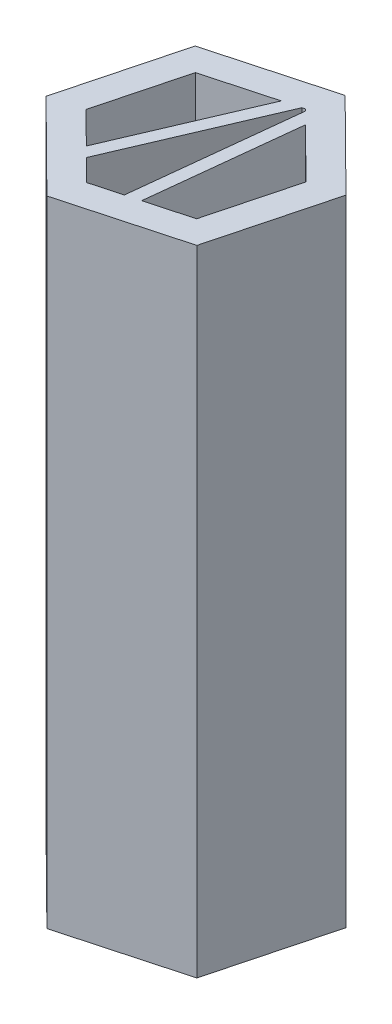
ISO-10303-21;
HEADER;
FILE_DESCRIPTION(('STEP AP214'),'2;1');
FILE_NAME('part.step','',(''),(''),'','','');
FILE_SCHEMA(('AUTOMOTIVE_DESIGN { 1 0 10303 214 1 1 1 1 }'));
ENDSEC;
DATA;
#1=APPLICATION_CONTEXT('core data for automotive mechanical design processes');
#2=APPLICATION_PROTOCOL_DEFINITION('international standard','automotive_design',2000,#1);
#3=PRODUCT_CONTEXT('',#1,'mechanical');
#4=PRODUCT('Part','Part','',(#3));
#5=PRODUCT_RELATED_PRODUCT_CATEGORY('part','',(#4));
#6=PRODUCT_DEFINITION_FORMATION('','',#4);
#7=PRODUCT_DEFINITION_CONTEXT('part definition',#1,'design');
#8=PRODUCT_DEFINITION('design','',#6,#7);
#9=PRODUCT_DEFINITION_SHAPE('','',#8);
#10=(LENGTH_UNIT() NAMED_UNIT(*) SI_UNIT(.MILLI.,.METRE.));
#11=(NAMED_UNIT(*) PLANE_ANGLE_UNIT() SI_UNIT($,.RADIAN.));
#12=(NAMED_UNIT(*) SI_UNIT($,.STERADIAN.) SOLID_ANGLE_UNIT());
#13=UNCERTAINTY_MEASURE_WITH_UNIT(LENGTH_MEASURE(1.E-05),#10,'distance_accuracy_value','');
#14=(GEOMETRIC_REPRESENTATION_CONTEXT(3) GLOBAL_UNCERTAINTY_ASSIGNED_CONTEXT((#13)) GLOBAL_UNIT_ASSIGNED_CONTEXT((#10,
#11,#12)) REPRESENTATION_CONTEXT('',''));
#15=CARTESIAN_POINT('',(0.,0.,0.));
#16=DIRECTION('',(0.,0.,1.));
#17=DIRECTION('',(1.,0.,0.));
#18=AXIS2_PLACEMENT_3D('',#15,#16,#17);
#19=CARTESIAN_POINT('',(-1.61287493858223,45.,6.14263524603461));
#20=DIRECTION('',(-0.263669614670392,0.,-0.964613048999218));
#21=DIRECTION('',(-0.964613048999218,0.,0.263669614670392));
#22=AXIS2_PLACEMENT_3D('',#19,#20,#21);
#23=PLANE('',#22);
#24=DIRECTION('',(0.,1.,0.));
#25=VECTOR('',#24,1.);
#26=CARTESIAN_POINT('',(0.485569831687937,0.,5.56904138416609));
#27=LINE('',#26,#25);
#28=CARTESIAN_POINT('',(0.485569831687937,0.,5.56904138416609));
#29=VERTEX_POINT('',#28);
#30=CARTESIAN_POINT('',(0.485569831687937,45.,5.56904138416609));
#31=VERTEX_POINT('',#30);
#32=EDGE_CURVE('E211',#29,#31,#27,.T.);
#33=ORIENTED_EDGE('',*,*,#32,.F.);
#34=DIRECTION('',(0.964613048999218,0.,-0.263669614670392));
#35=VECTOR('',#34,1.);
#36=CARTESIAN_POINT('',(-1.61287493858223,0.,6.14263524603461));
#37=LINE('',#36,#35);
#38=CARTESIAN_POINT('',(-1.61287493858223,0.,6.14263524603461));
#39=VERTEX_POINT('',#38);
#40=EDGE_CURVE('E275',#39,#29,#37,.T.);
#41=ORIENTED_EDGE('',*,*,#40,.F.);
#42=DIRECTION('',(0.,-1.,0.));
#43=VECTOR('',#42,1.);
#44=CARTESIAN_POINT('',(-1.61287493858223,45.,6.14263524603461));
#45=LINE('',#44,#43);
#46=CARTESIAN_POINT('',(-1.61287493858223,45.,6.14263524603461));
#47=VERTEX_POINT('',#46);
#48=EDGE_CURVE('E314',#47,#39,#45,.T.);
#49=ORIENTED_EDGE('',*,*,#48,.F.);
#50=DIRECTION('',(0.964613048999218,0.,-0.263669614670392));
#51=VECTOR('',#50,1.);
#52=CARTESIAN_POINT('',(-1.61287493858223,45.,6.14263524603461));
#53=LINE('',#52,#51);
#54=EDGE_CURVE('E55',#47,#31,#53,.T.);
#55=ORIENTED_EDGE('',*,*,#54,.T.);
#56=EDGE_LOOP('',(#33,#41,#49,#55));
#57=FACE_BOUND('',#56,.T.);
#58=ADVANCED_FACE('F39',(#57),#23,.T.);
#59=CARTESIAN_POINT('',(6.12611563853875,45.,-1.67452695307783));
#60=DIRECTION('',(-0.703544597920089,0.,0.710651109010223));
#61=DIRECTION('',(0.710651109010223,0.,0.703544597920089));
#62=AXIS2_PLACEMENT_3D('',#59,#60,#61);
#63=PLANE('',#62);
#64=DIRECTION('',(0.,1.,0.));
#65=VECTOR('',#64,1.);
#66=CARTESIAN_POINT('',(1.75500516038426,0.,-6.00192632645059));
#67=LINE('',#66,#65);
#68=CARTESIAN_POINT('',(1.75500516038426,0.,-6.00192632645059));
#69=VERTEX_POINT('',#68);
#70=CARTESIAN_POINT('',(1.75500516038426,45.,-6.00192632645059));
#71=VERTEX_POINT('',#70);
#72=EDGE_CURVE('E215',#69,#71,#67,.T.);
#73=ORIENTED_EDGE('',*,*,#72,.T.);
#74=DIRECTION('',(-0.710651109010223,0.,-0.703544597920089));
#75=VECTOR('',#74,1.);
#76=CARTESIAN_POINT('',(6.12611563853875,45.,-1.67452695307783));
#77=LINE('',#76,#75);
#78=CARTESIAN_POINT('',(1.61287493858221,45.,-6.14263524603461));
#79=VERTEX_POINT('',#78);
#80=EDGE_CURVE('E259',#71,#79,#77,.T.);
#81=ORIENTED_EDGE('',*,*,#80,.T.);
#82=DIRECTION('',(0.,-1.,0.));
#83=VECTOR('',#82,1.);
#84=CARTESIAN_POINT('',(1.61287493858221,45.,-6.14263524603461));
#85=LINE('',#84,#83);
#86=CARTESIAN_POINT('',(1.61287493858221,0.,-6.14263524603461));
#87=VERTEX_POINT('',#86);
#88=EDGE_CURVE('E304',#79,#87,#85,.T.);
#89=ORIENTED_EDGE('',*,*,#88,.T.);
#90=DIRECTION('',(-0.710651109010223,0.,-0.703544597920089));
#91=VECTOR('',#90,1.);
#92=CARTESIAN_POINT('',(6.12611563853875,0.,-1.67452695307783));
#93=LINE('',#92,#91);
#94=EDGE_CURVE('E283',#69,#87,#93,.T.);
#95=ORIENTED_EDGE('',*,*,#94,.F.);
#96=EDGE_LOOP('',(#73,#81,#89,#95));
#97=FACE_BOUND('',#96,.T.);
#98=ADVANCED_FACE('F418',(#97),#63,.T.);
#99=CARTESIAN_POINT('',(-6.12611563853876,45.,1.67452695307783));
#100=DIRECTION('',(0.70354459792009,0.,-0.710651109010222));
#101=DIRECTION('',(-0.710651109010222,0.,-0.70354459792009));
#102=AXIS2_PLACEMENT_3D('',#99,#100,#101);
#103=PLANE('',#102);
#104=DIRECTION('',(0.,1.,0.));
#105=VECTOR('',#104,1.);
#106=CARTESIAN_POINT('',(-3.86949528856049,0.,3.90858109955622));
#107=LINE('',#106,#105);
#108=CARTESIAN_POINT('',(-3.86949528856049,0.,3.90858109955622));
#109=VERTEX_POINT('',#108);
#110=CARTESIAN_POINT('',(-3.86949528856049,45.,3.90858109955622));
#111=VERTEX_POINT('',#110);
#112=EDGE_CURVE('E237',#109,#111,#107,.T.);
#113=ORIENTED_EDGE('',*,*,#112,.F.);
#114=DIRECTION('',(0.710651109010222,0.,0.70354459792009));
#115=VECTOR('',#114,1.);
#116=CARTESIAN_POINT('',(-6.12611563853876,0.,1.67452695307783));
#117=LINE('',#116,#115);
#118=CARTESIAN_POINT('',(-6.12611563853876,0.,1.67452695307783));
#119=VERTEX_POINT('',#118);
#120=EDGE_CURVE('E271',#119,#109,#117,.T.);
#121=ORIENTED_EDGE('',*,*,#120,.F.);
#122=DIRECTION('',(0.,-1.,0.));
#123=VECTOR('',#122,1.);
#124=CARTESIAN_POINT('',(-6.12611563853876,45.,1.67452695307783));
#125=LINE('',#124,#123);
#126=CARTESIAN_POINT('',(-6.12611563853876,45.,1.67452695307783));
#127=VERTEX_POINT('',#126);
#128=EDGE_CURVE('E270',#127,#119,#125,.T.);
#129=ORIENTED_EDGE('',*,*,#128,.F.);
#130=DIRECTION('',(0.710651109010222,0.,0.70354459792009));
#131=VECTOR('',#130,1.);
#132=CARTESIAN_POINT('',(-6.12611563853876,45.,1.67452695307783));
#133=LINE('',#132,#131);
#134=EDGE_CURVE('E188',#127,#111,#133,.T.);
#135=ORIENTED_EDGE('',*,*,#134,.T.);
#136=EDGE_LOOP('',(#113,#121,#129,#135));
#137=FACE_BOUND('',#136,.T.);
#138=ADVANCED_FACE('F414',(#137),#103,.T.);
#139=CARTESIAN_POINT('',(1.61287493858221,45.,-6.14263524603461));
#140=DIRECTION('',(0.263669614670392,0.,0.964613048999218));
#141=DIRECTION('',(0.964613048999218,0.,-0.263669614670392));
#142=AXIS2_PLACEMENT_3D('',#139,#140,#141);
#143=PLANE('',#142);
#144=DIRECTION('',(0.,1.,0.));
#145=VECTOR('',#144,1.);
#146=CARTESIAN_POINT('',(0.274314049450155,0.,-5.77674984336825));
#147=LINE('',#146,#145);
#148=CARTESIAN_POINT('',(0.274314049450155,0.,-5.77674984336825));
#149=VERTEX_POINT('',#148);
#150=CARTESIAN_POINT('',(0.274314049450155,45.,-5.77674984336825));
#151=VERTEX_POINT('',#150);
#152=EDGE_CURVE('E242',#149,#151,#147,.T.);
#153=ORIENTED_EDGE('',*,*,#152,.T.);
#154=DIRECTION('',(-0.964613048999218,0.,0.263669614670392));
#155=VECTOR('',#154,1.);
#156=CARTESIAN_POINT('',(1.61287493858221,45.,-6.14263524603461));
#157=LINE('',#156,#155);
#158=CARTESIAN_POINT('',(-4.51324069995654,45.,-4.46810829295678));
#159=VERTEX_POINT('',#158);
#160=EDGE_CURVE('E263',#151,#159,#157,.T.);
#161=ORIENTED_EDGE('',*,*,#160,.T.);
#162=DIRECTION('',(0.,-1.,0.));
#163=VECTOR('',#162,1.);
#164=CARTESIAN_POINT('',(-4.51324069995654,45.,-4.46810829295678));
#165=LINE('',#164,#163);
#166=CARTESIAN_POINT('',(-4.51324069995654,0.,-4.46810829295678));
#167=VERTEX_POINT('',#166);
#168=EDGE_CURVE('E300',#159,#167,#165,.T.);
#169=ORIENTED_EDGE('',*,*,#168,.T.);
#170=DIRECTION('',(-0.964613048999218,0.,0.263669614670392));
#171=VECTOR('',#170,1.);
#172=CARTESIAN_POINT('',(1.61287493858221,0.,-6.14263524603461));
#173=LINE('',#172,#171);
#174=EDGE_CURVE('E288',#149,#167,#173,.T.);
#175=ORIENTED_EDGE('',*,*,#174,.F.);
#176=EDGE_LOOP('',(#153,#161,#169,#175));
#177=FACE_BOUND('',#176,.T.);
#178=ADVANCED_FACE('F444',(#177),#143,.T.);
#179=CARTESIAN_POINT('',(0.,45.,0.));
#180=DIRECTION('',(0.,1.,0.));
#181=DIRECTION('',(0.,0.,1.));
#182=AXIS2_PLACEMENT_3D('',#179,#180,#181);
#183=PLANE('',#182);
#184=CARTESIAN_POINT('',(1.45018288068715,45.,5.30537176949569));
#185=VERTEX_POINT('',#184);
#186=CARTESIAN_POINT('',(4.51324069995653,45.,4.46810829295678));
#187=VERTEX_POINT('',#186);
#188=EDGE_CURVE('E179',#185,#187,#53,.T.);
#189=ORIENTED_EDGE('',*,*,#188,.F.);
#190=DIRECTION('',(0.109054331666609,0.,-0.994035790474744));
#191=VECTOR('',#190,1.);
#192=CARTESIAN_POINT('',(1.45018288068715,45.,5.30537176949569));
#193=LINE('',#192,#191);
#194=CARTESIAN_POINT('',(2.59902143673121,45.,-5.16635021286715));
#195=VERTEX_POINT('',#194);
#196=EDGE_CURVE('E184',#185,#195,#193,.T.);
#197=ORIENTED_EDGE('',*,*,#196,.T.);
#198=CARTESIAN_POINT('',(6.12611563853875,45.,-1.67452695307783));
#199=VERTEX_POINT('',#198);
#200=EDGE_CURVE('E260',#199,#195,#77,.T.);
#201=ORIENTED_EDGE('',*,*,#200,.F.);
#202=DIRECTION('',(0.253961939988995,0.,-0.967214212590482));
#203=VECTOR('',#202,1.);
#204=CARTESIAN_POINT('',(4.51324069995653,45.,4.46810829295678));
#205=LINE('',#204,#203);
#206=EDGE_CURVE('E185',#187,#199,#205,.T.);
#207=ORIENTED_EDGE('',*,*,#206,.F.);
#208=EDGE_LOOP('',(#189,#197,#201,#207));
#209=FACE_BOUND('',#208,.T.);
#210=CARTESIAN_POINT('',(-3.15884417955027,45.,4.61212569747631));
#211=VERTEX_POINT('',#210);
#212=EDGE_CURVE('E254',#211,#47,#133,.T.);
#213=ORIENTED_EDGE('',*,*,#212,.F.);
#214=DIRECTION('',(0.393354101438492,0.,-0.919387051726049));
#215=VECTOR('',#214,1.);
#216=CARTESIAN_POINT('',(1.41995232878237,45.,-6.08990132310053));
#217=LINE('',#216,#215);
#218=CARTESIAN_POINT('',(1.41995232878237,45.,-6.08990132310053));
#219=VERTEX_POINT('',#218);
#220=EDGE_CURVE('E214',#211,#219,#217,.T.);
#221=ORIENTED_EDGE('',*,*,#220,.T.);
#222=EDGE_CURVE('E264',#79,#219,#157,.T.);
#223=ORIENTED_EDGE('',*,*,#222,.F.);
#224=ORIENTED_EDGE('',*,*,#80,.F.);
#225=DIRECTION('',(-0.109054331666609,0.,0.994035790474744));
#226=VECTOR('',#225,1.);
#227=CARTESIAN_POINT('',(1.75500516038426,45.,-6.00192632645059));
#228=LINE('',#227,#226);
#229=EDGE_CURVE('E202',#71,#31,#228,.T.);
#230=ORIENTED_EDGE('',*,*,#229,.T.);
#231=ORIENTED_EDGE('',*,*,#54,.F.);
#232=EDGE_LOOP('',(#213,#221,#223,#224,#230,#231));
#233=FACE_BOUND('',#232,.T.);
#234=DIRECTION('',(0.964613048999217,0.,-0.263669614670393));
#235=VECTOR('',#234,1.);
#236=CARTESIAN_POINT('',(-2.19937491624849,45.,8.3763207900472));
#237=LINE('',#236,#235);
#238=CARTESIAN_POINT('',(-2.19937491624849,45.,8.3763207900472));
#239=VERTEX_POINT('',#238);
#240=CARTESIAN_POINT('',(6.15441913630438,45.,6.09287494494106));
#241=VERTEX_POINT('',#240);
#242=EDGE_CURVE('E319',#239,#241,#237,.T.);
#243=ORIENTED_EDGE('',*,*,#242,.T.);
#244=DIRECTION('',(0.253961939988995,0.,-0.967214212590482));
#245=VECTOR('',#244,1.);
#246=CARTESIAN_POINT('',(6.15441913630438,45.,6.09287494494106));
#247=LINE('',#246,#245);
#248=CARTESIAN_POINT('',(8.35379405255286,45.,-2.28344584510614));
#249=VERTEX_POINT('',#248);
#250=EDGE_CURVE('E323',#241,#249,#247,.T.);
#251=ORIENTED_EDGE('',*,*,#250,.T.);
#252=DIRECTION('',(-0.710651109010223,0.,-0.70354459792009));
#253=VECTOR('',#252,1.);
#254=CARTESIAN_POINT('',(8.35379405255286,45.,-2.28344584510614));
#255=LINE('',#254,#253);
#256=CARTESIAN_POINT('',(2.19937491624849,45.,-8.3763207900472));
#257=VERTEX_POINT('',#256);
#258=EDGE_CURVE('E327',#249,#257,#255,.T.);
#259=ORIENTED_EDGE('',*,*,#258,.T.);
#260=DIRECTION('',(-0.964613048999218,0.,0.263669614670392));
#261=VECTOR('',#260,1.);
#262=CARTESIAN_POINT('',(2.19937491624849,45.,-8.3763207900472));
#263=LINE('',#262,#261);
#264=CARTESIAN_POINT('',(-6.15441913630437,45.,-6.09287494494106));
#265=VERTEX_POINT('',#264);
#266=EDGE_CURVE('E330',#257,#265,#263,.T.);
#267=ORIENTED_EDGE('',*,*,#266,.T.);
#268=DIRECTION('',(-0.253961939988995,0.,0.967214212590482));
#269=VECTOR('',#268,1.);
#270=CARTESIAN_POINT('',(-6.15441913630437,45.,-6.09287494494106));
#271=LINE('',#270,#269);
#272=CARTESIAN_POINT('',(-8.35379405255286,45.,2.28344584510614));
#273=VERTEX_POINT('',#272);
#274=EDGE_CURVE('E333',#265,#273,#271,.T.);
#275=ORIENTED_EDGE('',*,*,#274,.T.);
#276=DIRECTION('',(0.710651109010223,0.,0.70354459792009));
#277=VECTOR('',#276,1.);
#278=CARTESIAN_POINT('',(-8.35379405255286,45.,2.28344584510614));
#279=LINE('',#278,#277);
#280=EDGE_CURVE('E336',#273,#239,#279,.T.);
#281=ORIENTED_EDGE('',*,*,#280,.T.);
#282=EDGE_LOOP('',(#243,#251,#259,#267,#275,#281));
#283=FACE_BOUND('',#282,.T.);
#284=DIRECTION('',(-0.393354101438492,0.,0.919387051726049));
#285=VECTOR('',#284,1.);
#286=CARTESIAN_POINT('',(-3.86949528856049,45.,3.90858109955622));
#287=LINE('',#286,#285);
#288=EDGE_CURVE('E226',#151,#111,#287,.T.);
#289=ORIENTED_EDGE('',*,*,#288,.T.);
#290=ORIENTED_EDGE('',*,*,#134,.F.);
#291=DIRECTION('',(-0.253961939988995,0.,0.967214212590482));
#292=VECTOR('',#291,1.);
#293=CARTESIAN_POINT('',(-4.51324069995654,45.,-4.46810829295678));
#294=LINE('',#293,#292);
#295=EDGE_CURVE('E267',#159,#127,#294,.T.);
#296=ORIENTED_EDGE('',*,*,#295,.F.);
#297=ORIENTED_EDGE('',*,*,#160,.F.);
#298=EDGE_LOOP('',(#289,#290,#296,#297));
#299=FACE_BOUND('',#298,.T.);
#300=ADVANCED_FACE('F180',(#209,#233,#283,#299),#183,.T.);
#301=CARTESIAN_POINT('',(0.,0.,0.));
#302=DIRECTION('',(0.,1.,0.));
#303=DIRECTION('',(0.,0.,1.));
#304=AXIS2_PLACEMENT_3D('',#301,#302,#303);
#305=PLANE('',#304);
#306=DIRECTION('',(0.109054331666609,0.,-0.994035790474744));
#307=VECTOR('',#306,1.);
#308=CARTESIAN_POINT('',(1.45018288068715,0.,5.30537176949569));
#309=LINE('',#308,#307);
#310=CARTESIAN_POINT('',(1.45018288068715,0.,5.3053717694957));
#311=VERTEX_POINT('',#310);
#312=CARTESIAN_POINT('',(2.59902143673121,0.,-5.16635021286715));
#313=VERTEX_POINT('',#312);
#314=EDGE_CURVE('E206',#311,#313,#309,.T.);
#315=ORIENTED_EDGE('',*,*,#314,.F.);
#316=CARTESIAN_POINT('',(4.51324069995653,0.,4.46810829295678));
#317=VERTEX_POINT('',#316);
#318=EDGE_CURVE('E63',#311,#317,#37,.T.);
#319=ORIENTED_EDGE('',*,*,#318,.T.);
#320=DIRECTION('',(0.253961939988995,0.,-0.967214212590482));
#321=VECTOR('',#320,1.);
#322=CARTESIAN_POINT('',(4.51324069995653,0.,4.46810829295678));
#323=LINE('',#322,#321);
#324=CARTESIAN_POINT('',(6.12611563853875,0.,-1.67452695307783));
#325=VERTEX_POINT('',#324);
#326=EDGE_CURVE('E279',#317,#325,#323,.T.);
#327=ORIENTED_EDGE('',*,*,#326,.T.);
#328=EDGE_CURVE('E284',#325,#313,#93,.T.);
#329=ORIENTED_EDGE('',*,*,#328,.T.);
#330=EDGE_LOOP('',(#315,#319,#327,#329));
#331=FACE_BOUND('',#330,.T.);
#332=DIRECTION('',(0.393354101438492,0.,-0.919387051726049));
#333=VECTOR('',#332,1.);
#334=CARTESIAN_POINT('',(1.41995232878237,0.,-6.08990132310053));
#335=LINE('',#334,#333);
#336=CARTESIAN_POINT('',(-3.15884417955027,0.,4.61212569747631));
#337=VERTEX_POINT('',#336);
#338=CARTESIAN_POINT('',(1.41995232878237,0.,-6.08990132310053));
#339=VERTEX_POINT('',#338);
#340=EDGE_CURVE('E221',#337,#339,#335,.T.);
#341=ORIENTED_EDGE('',*,*,#340,.F.);
#342=EDGE_CURVE('E241',#337,#39,#117,.T.);
#343=ORIENTED_EDGE('',*,*,#342,.T.);
#344=ORIENTED_EDGE('',*,*,#40,.T.);
#345=DIRECTION('',(-0.109054331666609,0.,0.994035790474744));
#346=VECTOR('',#345,1.);
#347=CARTESIAN_POINT('',(1.75500516038426,0.,-6.00192632645059));
#348=LINE('',#347,#346);
#349=EDGE_CURVE('E197',#69,#29,#348,.T.);
#350=ORIENTED_EDGE('',*,*,#349,.F.);
#351=ORIENTED_EDGE('',*,*,#94,.T.);
#352=EDGE_CURVE('E289',#87,#339,#173,.T.);
#353=ORIENTED_EDGE('',*,*,#352,.T.);
#354=EDGE_LOOP('',(#341,#343,#344,#350,#351,#353));
#355=FACE_BOUND('',#354,.T.);
#356=DIRECTION('',(0.964613048999217,0.,-0.263669614670393));
#357=VECTOR('',#356,1.);
#358=CARTESIAN_POINT('',(-2.19937491624849,0.,8.3763207900472));
#359=LINE('',#358,#357);
#360=CARTESIAN_POINT('',(-2.19937491624849,0.,8.3763207900472));
#361=VERTEX_POINT('',#360);
#362=CARTESIAN_POINT('',(6.15441913630438,0.,6.09287494494106));
#363=VERTEX_POINT('',#362);
#364=EDGE_CURVE('E318',#361,#363,#359,.T.);
#365=ORIENTED_EDGE('',*,*,#364,.F.);
#366=DIRECTION('',(0.710651109010223,0.,0.70354459792009));
#367=VECTOR('',#366,1.);
#368=CARTESIAN_POINT('',(-8.35379405255286,0.,2.28344584510614));
#369=LINE('',#368,#367);
#370=CARTESIAN_POINT('',(-8.35379405255286,0.,2.28344584510614));
#371=VERTEX_POINT('',#370);
#372=EDGE_CURVE('E324',#371,#361,#369,.T.);
#373=ORIENTED_EDGE('',*,*,#372,.F.);
#374=DIRECTION('',(-0.253961939988995,0.,0.967214212590482));
#375=VECTOR('',#374,1.);
#376=CARTESIAN_POINT('',(-6.15441913630437,0.,-6.09287494494106));
#377=LINE('',#376,#375);
#378=CARTESIAN_POINT('',(-6.15441913630437,0.,-6.09287494494106));
#379=VERTEX_POINT('',#378);
#380=EDGE_CURVE('E352',#379,#371,#377,.T.);
#381=ORIENTED_EDGE('',*,*,#380,.F.);
#382=DIRECTION('',(-0.964613048999218,0.,0.263669614670392));
#383=VECTOR('',#382,1.);
#384=CARTESIAN_POINT('',(2.19937491624849,0.,-8.3763207900472));
#385=LINE('',#384,#383);
#386=CARTESIAN_POINT('',(2.19937491624849,0.,-8.3763207900472));
#387=VERTEX_POINT('',#386);
#388=EDGE_CURVE('E349',#387,#379,#385,.T.);
#389=ORIENTED_EDGE('',*,*,#388,.F.);
#390=DIRECTION('',(-0.710651109010223,0.,-0.70354459792009));
#391=VECTOR('',#390,1.);
#392=CARTESIAN_POINT('',(8.35379405255286,0.,-2.28344584510614));
#393=LINE('',#392,#391);
#394=CARTESIAN_POINT('',(8.35379405255286,0.,-2.28344584510614));
#395=VERTEX_POINT('',#394);
#396=EDGE_CURVE('E346',#395,#387,#393,.T.);
#397=ORIENTED_EDGE('',*,*,#396,.F.);
#398=DIRECTION('',(0.253961939988995,0.,-0.967214212590482));
#399=VECTOR('',#398,1.);
#400=CARTESIAN_POINT('',(6.15441913630438,0.,6.09287494494106));
#401=LINE('',#400,#399);
#402=EDGE_CURVE('E343',#363,#395,#401,.T.);
#403=ORIENTED_EDGE('',*,*,#402,.F.);
#404=EDGE_LOOP('',(#365,#373,#381,#389,#397,#403));
#405=FACE_BOUND('',#404,.T.);
#406=ORIENTED_EDGE('',*,*,#120,.T.);
#407=DIRECTION('',(-0.393354101438492,0.,0.919387051726049));
#408=VECTOR('',#407,1.);
#409=CARTESIAN_POINT('',(-3.86949528856049,0.,3.90858109955622));
#410=LINE('',#409,#408);
#411=EDGE_CURVE('E225',#149,#109,#410,.T.);
#412=ORIENTED_EDGE('',*,*,#411,.F.);
#413=ORIENTED_EDGE('',*,*,#174,.T.);
#414=DIRECTION('',(-0.253961939988995,0.,0.967214212590482));
#415=VECTOR('',#414,1.);
#416=CARTESIAN_POINT('',(-4.51324069995654,0.,-4.46810829295678));
#417=LINE('',#416,#415);
#418=EDGE_CURVE('E293',#167,#119,#417,.T.);
#419=ORIENTED_EDGE('',*,*,#418,.T.);
#420=EDGE_LOOP('',(#406,#412,#413,#419));
#421=FACE_BOUND('',#420,.T.);
#422=ADVANCED_FACE('F383',(#331,#355,#405,#421),#305,.F.);
#423=CARTESIAN_POINT('',(-2.19937491624849,45.,8.3763207900472));
#424=DIRECTION('',(-0.263669614670393,0.,-0.964613048999217));
#425=DIRECTION('',(-0.964613048999217,0.,0.263669614670393));
#426=AXIS2_PLACEMENT_3D('',#423,#424,#425);
#427=PLANE('',#426);
#428=ORIENTED_EDGE('',*,*,#364,.T.);
#429=DIRECTION('',(0.,-1.,0.));
#430=VECTOR('',#429,1.);
#431=CARTESIAN_POINT('',(6.15441913630438,45.,6.09287494494106));
#432=LINE('',#431,#430);
#433=EDGE_CURVE('E11',#241,#363,#432,.T.);
#434=ORIENTED_EDGE('',*,*,#433,.F.);
#435=ORIENTED_EDGE('',*,*,#242,.F.);
#436=DIRECTION('',(0.,-1.,0.));
#437=VECTOR('',#436,1.);
#438=CARTESIAN_POINT('',(-2.19937491624849,45.,8.3763207900472));
#439=LINE('',#438,#437);
#440=EDGE_CURVE('E339',#239,#361,#439,.T.);
#441=ORIENTED_EDGE('',*,*,#440,.T.);
#442=EDGE_LOOP('',(#428,#434,#435,#441));
#443=FACE_BOUND('',#442,.T.);
#444=ADVANCED_FACE('F41',(#443),#427,.F.);
#445=CARTESIAN_POINT('',(6.15441913630438,45.,6.09287494494106));
#446=DIRECTION('',(-0.967214212590482,0.,-0.253961939988995));
#447=DIRECTION('',(-0.253961939988995,0.,0.967214212590482));
#448=AXIS2_PLACEMENT_3D('',#445,#446,#447);
#449=PLANE('',#448);
#450=ORIENTED_EDGE('',*,*,#402,.T.);
#451=DIRECTION('',(0.,-1.,0.));
#452=VECTOR('',#451,1.);
#453=CARTESIAN_POINT('',(8.35379405255286,45.,-2.28344584510614));
#454=LINE('',#453,#452);
#455=EDGE_CURVE('E48',#249,#395,#454,.T.);
#456=ORIENTED_EDGE('',*,*,#455,.F.);
#457=ORIENTED_EDGE('',*,*,#250,.F.);
#458=ORIENTED_EDGE('',*,*,#433,.T.);
#459=EDGE_LOOP('',(#450,#456,#457,#458));
#460=FACE_BOUND('',#459,.T.);
#461=ADVANCED_FACE('F401',(#460),#449,.F.);
#462=CARTESIAN_POINT('',(8.35379405255286,45.,-2.28344584510614));
#463=DIRECTION('',(-0.70354459792009,0.,0.710651109010223));
#464=DIRECTION('',(0.710651109010223,0.,0.70354459792009));
#465=AXIS2_PLACEMENT_3D('',#462,#463,#464);
#466=PLANE('',#465);
#467=ORIENTED_EDGE('',*,*,#396,.T.);
#468=DIRECTION('',(0.,-1.,0.));
#469=VECTOR('',#468,1.);
#470=CARTESIAN_POINT('',(2.19937491624849,45.,-8.3763207900472));
#471=LINE('',#470,#469);
#472=EDGE_CURVE('E368',#257,#387,#471,.T.);
#473=ORIENTED_EDGE('',*,*,#472,.F.);
#474=ORIENTED_EDGE('',*,*,#258,.F.);
#475=ORIENTED_EDGE('',*,*,#455,.T.);
#476=EDGE_LOOP('',(#467,#473,#474,#475));
#477=FACE_BOUND('',#476,.T.);
#478=ADVANCED_FACE('F377',(#477),#466,.F.);
#479=CARTESIAN_POINT('',(2.19937491624849,45.,-8.3763207900472));
#480=DIRECTION('',(0.263669614670392,0.,0.964613048999217));
#481=DIRECTION('',(0.964613048999218,0.,-0.263669614670392));
#482=AXIS2_PLACEMENT_3D('',#479,#480,#481);
#483=PLANE('',#482);
#484=ORIENTED_EDGE('',*,*,#388,.T.);
#485=DIRECTION('',(0.,-1.,0.));
#486=VECTOR('',#485,1.);
#487=CARTESIAN_POINT('',(-6.15441913630437,45.,-6.09287494494106));
#488=LINE('',#487,#486);
#489=EDGE_CURVE('E364',#265,#379,#488,.T.);
#490=ORIENTED_EDGE('',*,*,#489,.F.);
#491=ORIENTED_EDGE('',*,*,#266,.F.);
#492=ORIENTED_EDGE('',*,*,#472,.T.);
#493=EDGE_LOOP('',(#484,#490,#491,#492));
#494=FACE_BOUND('',#493,.T.);
#495=ADVANCED_FACE('F389',(#494),#483,.F.);
#496=CARTESIAN_POINT('',(-6.15441913630437,45.,-6.09287494494106));
#497=DIRECTION('',(0.967214212590482,0.,0.253961939988995));
#498=DIRECTION('',(0.253961939988995,0.,-0.967214212590482));
#499=AXIS2_PLACEMENT_3D('',#496,#497,#498);
#500=PLANE('',#499);
#501=ORIENTED_EDGE('',*,*,#380,.T.);
#502=DIRECTION('',(0.,-1.,0.));
#503=VECTOR('',#502,1.);
#504=CARTESIAN_POINT('',(-8.35379405255286,45.,2.28344584510614));
#505=LINE('',#504,#503);
#506=EDGE_CURVE('E360',#273,#371,#505,.T.);
#507=ORIENTED_EDGE('',*,*,#506,.F.);
#508=ORIENTED_EDGE('',*,*,#274,.F.);
#509=ORIENTED_EDGE('',*,*,#489,.T.);
#510=EDGE_LOOP('',(#501,#507,#508,#509));
#511=FACE_BOUND('',#510,.T.);
#512=ADVANCED_FACE('F393',(#511),#500,.F.);
#513=CARTESIAN_POINT('',(-8.35379405255286,45.,2.28344584510614));
#514=DIRECTION('',(0.70354459792009,0.,-0.710651109010222));
#515=DIRECTION('',(-0.710651109010223,0.,-0.70354459792009));
#516=AXIS2_PLACEMENT_3D('',#513,#514,#515);
#517=PLANE('',#516);
#518=ORIENTED_EDGE('',*,*,#372,.T.);
#519=ORIENTED_EDGE('',*,*,#440,.F.);
#520=ORIENTED_EDGE('',*,*,#280,.F.);
#521=ORIENTED_EDGE('',*,*,#506,.T.);
#522=EDGE_LOOP('',(#518,#519,#520,#521));
#523=FACE_BOUND('',#522,.T.);
#524=ADVANCED_FACE('F404',(#523),#517,.F.);
#525=DIRECTION('',(0.,1.,0.));
#526=VECTOR('',#525,1.);
#527=CARTESIAN_POINT('',(-3.15884417955027,0.,4.61212569747631));
#528=LINE('',#527,#526);
#529=EDGE_CURVE('E230',#337,#211,#528,.T.);
#530=ORIENTED_EDGE('',*,*,#529,.T.);
#531=ORIENTED_EDGE('',*,*,#212,.T.);
#532=ORIENTED_EDGE('',*,*,#48,.T.);
#533=ORIENTED_EDGE('',*,*,#342,.F.);
#534=EDGE_LOOP('',(#530,#531,#532,#533));
#535=FACE_BOUND('',#534,.T.);
#536=ADVANCED_FACE('F406',(#535),#103,.T.);
#537=DIRECTION('',(0.,1.,0.));
#538=VECTOR('',#537,1.);
#539=CARTESIAN_POINT('',(1.45018288068715,0.,5.30537176949569));
#540=LINE('',#539,#538);
#541=EDGE_CURVE('E190',#311,#185,#540,.T.);
#542=ORIENTED_EDGE('',*,*,#541,.T.);
#543=ORIENTED_EDGE('',*,*,#188,.T.);
#544=DIRECTION('',(0.,-1.,0.));
#545=VECTOR('',#544,1.);
#546=CARTESIAN_POINT('',(4.51324069995653,45.,4.46810829295678));
#547=LINE('',#546,#545);
#548=EDGE_CURVE('E311',#187,#317,#547,.T.);
#549=ORIENTED_EDGE('',*,*,#548,.T.);
#550=ORIENTED_EDGE('',*,*,#318,.F.);
#551=EDGE_LOOP('',(#542,#543,#549,#550));
#552=FACE_BOUND('',#551,.T.);
#553=ADVANCED_FACE('F191',(#552),#23,.T.);
#554=CARTESIAN_POINT('',(4.51324069995653,45.,4.46810829295678));
#555=DIRECTION('',(-0.967214212590482,0.,-0.253961939988995));
#556=DIRECTION('',(-0.253961939988995,0.,0.967214212590482));
#557=AXIS2_PLACEMENT_3D('',#554,#555,#556);
#558=PLANE('',#557);
#559=ORIENTED_EDGE('',*,*,#326,.F.);
#560=ORIENTED_EDGE('',*,*,#548,.F.);
#561=ORIENTED_EDGE('',*,*,#206,.T.);
#562=DIRECTION('',(0.,-1.,0.));
#563=VECTOR('',#562,1.);
#564=CARTESIAN_POINT('',(6.12611563853875,45.,-1.67452695307783));
#565=LINE('',#564,#563);
#566=EDGE_CURVE('E308',#199,#325,#565,.T.);
#567=ORIENTED_EDGE('',*,*,#566,.T.);
#568=EDGE_LOOP('',(#559,#560,#561,#567));
#569=FACE_BOUND('',#568,.T.);
#570=ADVANCED_FACE('F428',(#569),#558,.T.);
#571=DIRECTION('',(0.,1.,0.));
#572=VECTOR('',#571,1.);
#573=CARTESIAN_POINT('',(2.59902143673121,0.,-5.16635021286715));
#574=LINE('',#573,#572);
#575=EDGE_CURVE('E196',#313,#195,#574,.T.);
#576=ORIENTED_EDGE('',*,*,#575,.F.);
#577=ORIENTED_EDGE('',*,*,#328,.F.);
#578=ORIENTED_EDGE('',*,*,#566,.F.);
#579=ORIENTED_EDGE('',*,*,#200,.T.);
#580=EDGE_LOOP('',(#576,#577,#578,#579));
#581=FACE_BOUND('',#580,.T.);
#582=ADVANCED_FACE('F425',(#581),#63,.T.);
#583=DIRECTION('',(0.,1.,0.));
#584=VECTOR('',#583,1.);
#585=CARTESIAN_POINT('',(1.41995232878237,0.,-6.08990132310053));
#586=LINE('',#585,#584);
#587=EDGE_CURVE('E246',#339,#219,#586,.T.);
#588=ORIENTED_EDGE('',*,*,#587,.F.);
#589=ORIENTED_EDGE('',*,*,#352,.F.);
#590=ORIENTED_EDGE('',*,*,#88,.F.);
#591=ORIENTED_EDGE('',*,*,#222,.T.);
#592=EDGE_LOOP('',(#588,#589,#590,#591));
#593=FACE_BOUND('',#592,.T.);
#594=ADVANCED_FACE('F436',(#593),#143,.T.);
#595=CARTESIAN_POINT('',(-4.51324069995654,45.,-4.46810829295678));
#596=DIRECTION('',(0.967214212590482,0.,0.253961939988995));
#597=DIRECTION('',(0.253961939988995,0.,-0.967214212590482));
#598=AXIS2_PLACEMENT_3D('',#595,#596,#597);
#599=PLANE('',#598);
#600=ORIENTED_EDGE('',*,*,#418,.F.);
#601=ORIENTED_EDGE('',*,*,#168,.F.);
#602=ORIENTED_EDGE('',*,*,#295,.T.);
#603=ORIENTED_EDGE('',*,*,#128,.T.);
#604=EDGE_LOOP('',(#600,#601,#602,#603));
#605=FACE_BOUND('',#604,.T.);
#606=ADVANCED_FACE('F442',(#605),#599,.T.);
#607=CARTESIAN_POINT('',(-3.86949528856049,0.,3.90858109955622));
#608=DIRECTION('',(-0.919387051726049,0.,-0.393354101438492));
#609=DIRECTION('',(-0.393354101438492,0.,0.919387051726049));
#610=AXIS2_PLACEMENT_3D('',#607,#608,#609);
#611=PLANE('',#610);
#612=ORIENTED_EDGE('',*,*,#288,.F.);
#613=ORIENTED_EDGE('',*,*,#152,.F.);
#614=ORIENTED_EDGE('',*,*,#411,.T.);
#615=ORIENTED_EDGE('',*,*,#112,.T.);
#616=EDGE_LOOP('',(#612,#613,#614,#615));
#617=FACE_BOUND('',#616,.T.);
#618=ADVANCED_FACE('F447',(#617),#611,.T.);
#619=CARTESIAN_POINT('',(1.41995232878237,0.,-6.08990132310053));
#620=DIRECTION('',(0.919387051726049,0.,0.393354101438492));
#621=DIRECTION('',(0.393354101438493,0.,-0.919387051726049));
#622=AXIS2_PLACEMENT_3D('',#619,#620,#621);
#623=PLANE('',#622);
#624=ORIENTED_EDGE('',*,*,#220,.F.);
#625=ORIENTED_EDGE('',*,*,#529,.F.);
#626=ORIENTED_EDGE('',*,*,#340,.T.);
#627=ORIENTED_EDGE('',*,*,#587,.T.);
#628=EDGE_LOOP('',(#624,#625,#626,#627));
#629=FACE_BOUND('',#628,.T.);
#630=ADVANCED_FACE('F449',(#629),#623,.T.);
#631=CARTESIAN_POINT('',(1.75500516038426,0.,-6.00192632645059));
#632=DIRECTION('',(-0.994035790474744,0.,-0.109054331666609));
#633=DIRECTION('',(-0.109054331666609,0.,0.994035790474744));
#634=AXIS2_PLACEMENT_3D('',#631,#632,#633);
#635=PLANE('',#634);
#636=ORIENTED_EDGE('',*,*,#229,.F.);
#637=ORIENTED_EDGE('',*,*,#72,.F.);
#638=ORIENTED_EDGE('',*,*,#349,.T.);
#639=ORIENTED_EDGE('',*,*,#32,.T.);
#640=EDGE_LOOP('',(#636,#637,#638,#639));
#641=FACE_BOUND('',#640,.T.);
#642=ADVANCED_FACE('F452',(#641),#635,.T.);
#643=CARTESIAN_POINT('',(1.45018288068715,0.,5.30537176949569));
#644=DIRECTION('',(0.994035790474744,0.,0.109054331666609));
#645=DIRECTION('',(0.109054331666609,0.,-0.994035790474744));
#646=AXIS2_PLACEMENT_3D('',#643,#644,#645);
#647=PLANE('',#646);
#648=ORIENTED_EDGE('',*,*,#196,.F.);
#649=ORIENTED_EDGE('',*,*,#541,.F.);
#650=ORIENTED_EDGE('',*,*,#314,.T.);
#651=ORIENTED_EDGE('',*,*,#575,.T.);
#652=EDGE_LOOP('',(#648,#649,#650,#651));
#653=FACE_BOUND('',#652,.T.);
#654=ADVANCED_FACE('F200',(#653),#647,.T.);
#655=CLOSED_SHELL('',(#58,#98,#138,#178,#300,#422,#444,#461,#478,#495,#512,#524,#536,#553,#570,
#582,#594,#606,#618,#630,#642,#654));
#656=MANIFOLD_SOLID_BREP('B2',#655);
#657=ADVANCED_BREP_SHAPE_REPRESENTATION('',(#18,#656),#14);
#658=SHAPE_DEFINITION_REPRESENTATION(#9,#657);
ENDSEC;
END-ISO-10303-21;
